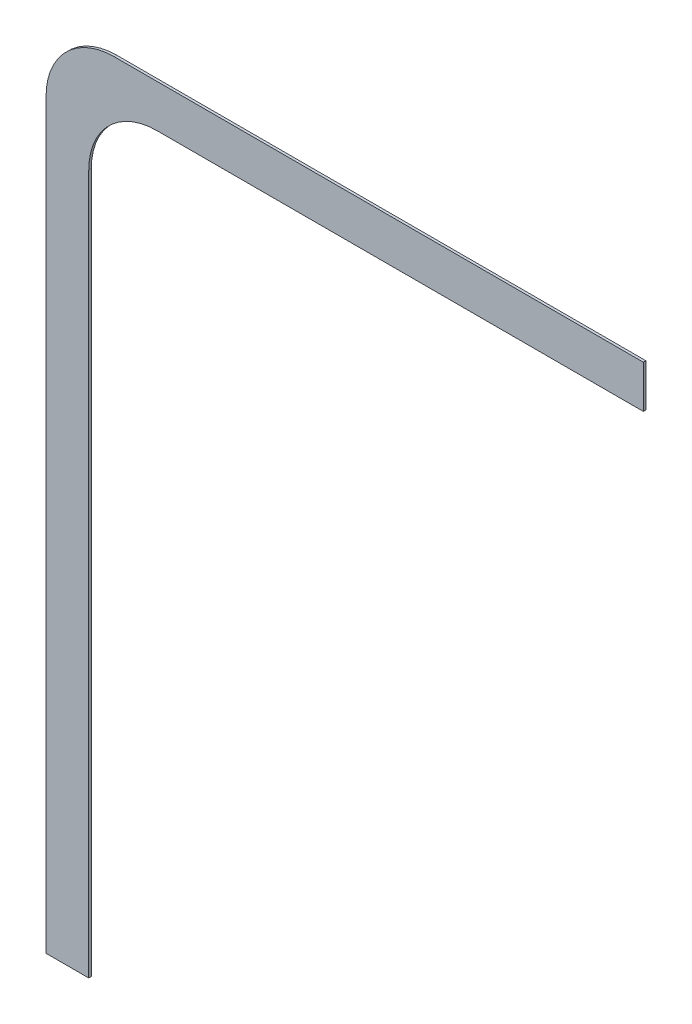
ISO-10303-21;
HEADER;
FILE_DESCRIPTION(('STEP AP214'),'2;1');
FILE_NAME('part.step','',(''),(''),'','','');
FILE_SCHEMA(('AUTOMOTIVE_DESIGN { 1 0 10303 214 1 1 1 1 }'));
ENDSEC;
DATA;
#1=APPLICATION_CONTEXT('core data for automotive mechanical design processes');
#2=APPLICATION_PROTOCOL_DEFINITION('international standard','automotive_design',2000,#1);
#3=PRODUCT_CONTEXT('',#1,'mechanical');
#4=PRODUCT('Part','Part','',(#3));
#5=PRODUCT_RELATED_PRODUCT_CATEGORY('part','',(#4));
#6=PRODUCT_DEFINITION_FORMATION('','',#4);
#7=PRODUCT_DEFINITION_CONTEXT('part definition',#1,'design');
#8=PRODUCT_DEFINITION('design','',#6,#7);
#9=PRODUCT_DEFINITION_SHAPE('','',#8);
#10=(LENGTH_UNIT() NAMED_UNIT(*) SI_UNIT(.MILLI.,.METRE.));
#11=(NAMED_UNIT(*) PLANE_ANGLE_UNIT() SI_UNIT($,.RADIAN.));
#12=(NAMED_UNIT(*) SI_UNIT($,.STERADIAN.) SOLID_ANGLE_UNIT());
#13=UNCERTAINTY_MEASURE_WITH_UNIT(LENGTH_MEASURE(1.E-05),#10,'distance_accuracy_value','');
#14=(GEOMETRIC_REPRESENTATION_CONTEXT(3) GLOBAL_UNCERTAINTY_ASSIGNED_CONTEXT((#13)) GLOBAL_UNIT_ASSIGNED_CONTEXT((#10,
#11,#12)) REPRESENTATION_CONTEXT('',''));
#15=CARTESIAN_POINT('',(0.,0.,0.));
#16=DIRECTION('',(0.,0.,1.));
#17=DIRECTION('',(1.,0.,0.));
#18=AXIS2_PLACEMENT_3D('',#15,#16,#17);
#19=CARTESIAN_POINT('',(50.,0.,3.));
#20=DIRECTION('',(0.,1.,0.));
#21=DIRECTION('',(-1.,0.,0.));
#22=AXIS2_PLACEMENT_3D('',#19,#20,#21);
#23=PLANE('',#22);
#24=DIRECTION('',(1.,0.,0.));
#25=VECTOR('',#24,1.);
#26=CARTESIAN_POINT('',(50.,0.,0.));
#27=LINE('',#26,#25);
#28=CARTESIAN_POINT('',(0.,0.,0.));
#29=VERTEX_POINT('',#28);
#30=CARTESIAN_POINT('',(50.,0.,0.));
#31=VERTEX_POINT('',#30);
#32=EDGE_CURVE('E135',#29,#31,#27,.T.);
#33=ORIENTED_EDGE('',*,*,#32,.T.);
#34=DIRECTION('',(0.,0.,-1.));
#35=VECTOR('',#34,1.);
#36=CARTESIAN_POINT('',(50.,0.,3.));
#37=LINE('',#36,#35);
#38=CARTESIAN_POINT('',(50.,0.,3.));
#39=VERTEX_POINT('',#38);
#40=EDGE_CURVE('E11',#39,#31,#37,.T.);
#41=ORIENTED_EDGE('',*,*,#40,.F.);
#42=DIRECTION('',(1.,0.,0.));
#43=VECTOR('',#42,1.);
#44=CARTESIAN_POINT('',(50.,0.,3.));
#45=LINE('',#44,#43);
#46=CARTESIAN_POINT('',(0.,0.,3.));
#47=VERTEX_POINT('',#46);
#48=EDGE_CURVE('E149',#47,#39,#45,.T.);
#49=ORIENTED_EDGE('',*,*,#48,.F.);
#50=DIRECTION('',(0.,0.,-1.));
#51=VECTOR('',#50,1.);
#52=CARTESIAN_POINT('',(0.,0.,3.));
#53=LINE('',#52,#51);
#54=EDGE_CURVE('E131',#47,#29,#53,.T.);
#55=ORIENTED_EDGE('',*,*,#54,.T.);
#56=EDGE_LOOP('',(#33,#41,#49,#55));
#57=FACE_BOUND('',#56,.T.);
#58=ADVANCED_FACE('F39',(#57),#23,.F.);
#59=CARTESIAN_POINT('',(50.,820.,3.));
#60=DIRECTION('',(-1.,0.,0.));
#61=DIRECTION('',(0.,-1.,0.));
#62=AXIS2_PLACEMENT_3D('',#59,#60,#61);
#63=PLANE('',#62);
#64=DIRECTION('',(0.,1.,0.));
#65=VECTOR('',#64,1.);
#66=CARTESIAN_POINT('',(50.,820.,0.));
#67=LINE('',#66,#65);
#68=CARTESIAN_POINT('',(49.9999999999999,820.,0.));
#69=VERTEX_POINT('',#68);
#70=EDGE_CURVE('E138',#31,#69,#67,.T.);
#71=ORIENTED_EDGE('',*,*,#70,.T.);
#72=DIRECTION('',(0.,0.,-1.));
#73=VECTOR('',#72,1.);
#74=CARTESIAN_POINT('',(49.9999999999999,820.,3.));
#75=LINE('',#74,#73);
#76=CARTESIAN_POINT('',(49.9999999999999,820.,3.));
#77=VERTEX_POINT('',#76);
#78=EDGE_CURVE('E47',#77,#69,#75,.T.);
#79=ORIENTED_EDGE('',*,*,#78,.F.);
#80=DIRECTION('',(0.,1.,0.));
#81=VECTOR('',#80,1.);
#82=CARTESIAN_POINT('',(50.,820.,3.));
#83=LINE('',#82,#81);
#84=EDGE_CURVE('E98',#39,#77,#83,.T.);
#85=ORIENTED_EDGE('',*,*,#84,.F.);
#86=ORIENTED_EDGE('',*,*,#40,.T.);
#87=EDGE_LOOP('',(#71,#79,#85,#86));
#88=FACE_BOUND('',#87,.T.);
#89=ADVANCED_FACE('F184',(#88),#63,.F.);
#90=CARTESIAN_POINT('',(130.,820.,3.));
#91=DIRECTION('',(0.,0.,-1.));
#92=DIRECTION('',(-1.,0.,0.));
#93=AXIS2_PLACEMENT_3D('',#90,#91,#92);
#94=CYLINDRICAL_SURFACE('',#93,80.);
#95=CARTESIAN_POINT('',(130.,820.,0.));
#96=DIRECTION('',(0.,0.,-1.));
#97=DIRECTION('',(1.,0.,0.));
#98=AXIS2_PLACEMENT_3D('',#95,#96,#97);
#99=CIRCLE('',#98,80.);
#100=CARTESIAN_POINT('',(130.,900.,0.));
#101=VERTEX_POINT('',#100);
#102=EDGE_CURVE('E140',#69,#101,#99,.T.);
#103=ORIENTED_EDGE('',*,*,#102,.T.);
#104=DIRECTION('',(0.,0.,-1.));
#105=VECTOR('',#104,1.);
#106=CARTESIAN_POINT('',(130.,900.,3.));
#107=LINE('',#106,#105);
#108=CARTESIAN_POINT('',(130.,900.,3.));
#109=VERTEX_POINT('',#108);
#110=EDGE_CURVE('E156',#109,#101,#107,.T.);
#111=ORIENTED_EDGE('',*,*,#110,.F.);
#112=CARTESIAN_POINT('',(130.,820.,3.));
#113=DIRECTION('',(0.,0.,-1.));
#114=DIRECTION('',(1.,0.,0.));
#115=AXIS2_PLACEMENT_3D('',#112,#113,#114);
#116=CIRCLE('',#115,80.);
#117=EDGE_CURVE('E164',#77,#109,#116,.T.);
#118=ORIENTED_EDGE('',*,*,#117,.F.);
#119=ORIENTED_EDGE('',*,*,#78,.T.);
#120=EDGE_LOOP('',(#103,#111,#118,#119));
#121=FACE_BOUND('',#120,.T.);
#122=ADVANCED_FACE('F162',(#121),#94,.F.);
#123=CARTESIAN_POINT('',(700.,900.,3.));
#124=DIRECTION('',(0.,1.,0.));
#125=DIRECTION('',(-1.,0.,0.));
#126=AXIS2_PLACEMENT_3D('',#123,#124,#125);
#127=PLANE('',#126);
#128=DIRECTION('',(1.,0.,0.));
#129=VECTOR('',#128,1.);
#130=CARTESIAN_POINT('',(700.,900.,0.));
#131=LINE('',#130,#129);
#132=CARTESIAN_POINT('',(700.,900.,0.));
#133=VERTEX_POINT('',#132);
#134=EDGE_CURVE('E142',#101,#133,#131,.T.);
#135=ORIENTED_EDGE('',*,*,#134,.T.);
#136=DIRECTION('',(0.,0.,-1.));
#137=VECTOR('',#136,1.);
#138=CARTESIAN_POINT('',(700.,900.,3.));
#139=LINE('',#138,#137);
#140=CARTESIAN_POINT('',(700.,900.,3.));
#141=VERTEX_POINT('',#140);
#142=EDGE_CURVE('E153',#141,#133,#139,.T.);
#143=ORIENTED_EDGE('',*,*,#142,.F.);
#144=DIRECTION('',(1.,0.,0.));
#145=VECTOR('',#144,1.);
#146=CARTESIAN_POINT('',(700.,900.,3.));
#147=LINE('',#146,#145);
#148=EDGE_CURVE('E176',#109,#141,#147,.T.);
#149=ORIENTED_EDGE('',*,*,#148,.F.);
#150=ORIENTED_EDGE('',*,*,#110,.T.);
#151=EDGE_LOOP('',(#135,#143,#149,#150));
#152=FACE_BOUND('',#151,.T.);
#153=ADVANCED_FACE('F172',(#152),#127,.F.);
#154=CARTESIAN_POINT('',(700.,950.,3.));
#155=DIRECTION('',(-1.,0.,0.));
#156=DIRECTION('',(0.,0.,1.));
#157=AXIS2_PLACEMENT_3D('',#154,#155,#156);
#158=PLANE('',#157);
#159=DIRECTION('',(0.,1.,0.));
#160=VECTOR('',#159,1.);
#161=CARTESIAN_POINT('',(700.,950.,0.));
#162=LINE('',#161,#160);
#163=CARTESIAN_POINT('',(700.,950.,0.));
#164=VERTEX_POINT('',#163);
#165=EDGE_CURVE('E144',#133,#164,#162,.T.);
#166=ORIENTED_EDGE('',*,*,#165,.T.);
#167=DIRECTION('',(0.,0.,-1.));
#168=VECTOR('',#167,1.);
#169=CARTESIAN_POINT('',(700.,950.,3.));
#170=LINE('',#169,#168);
#171=CARTESIAN_POINT('',(700.,950.,3.));
#172=VERTEX_POINT('',#171);
#173=EDGE_CURVE('E126',#172,#164,#170,.T.);
#174=ORIENTED_EDGE('',*,*,#173,.F.);
#175=DIRECTION('',(0.,1.,0.));
#176=VECTOR('',#175,1.);
#177=CARTESIAN_POINT('',(700.,950.,3.));
#178=LINE('',#177,#176);
#179=EDGE_CURVE('E117',#141,#172,#178,.T.);
#180=ORIENTED_EDGE('',*,*,#179,.F.);
#181=ORIENTED_EDGE('',*,*,#142,.T.);
#182=EDGE_LOOP('',(#166,#174,#180,#181));
#183=FACE_BOUND('',#182,.T.);
#184=ADVANCED_FACE('F175',(#183),#158,.F.);
#185=CARTESIAN_POINT('',(80.,950.,3.));
#186=DIRECTION('',(0.,-1.,0.));
#187=DIRECTION('',(1.,0.,0.));
#188=AXIS2_PLACEMENT_3D('',#185,#186,#187);
#189=PLANE('',#188);
#190=DIRECTION('',(-1.,0.,0.));
#191=VECTOR('',#190,1.);
#192=CARTESIAN_POINT('',(80.,950.,0.));
#193=LINE('',#192,#191);
#194=CARTESIAN_POINT('',(80.,950.,0.));
#195=VERTEX_POINT('',#194);
#196=EDGE_CURVE('E125',#164,#195,#193,.T.);
#197=ORIENTED_EDGE('',*,*,#196,.T.);
#198=DIRECTION('',(0.,0.,-1.));
#199=VECTOR('',#198,1.);
#200=CARTESIAN_POINT('',(80.,950.,3.));
#201=LINE('',#200,#199);
#202=CARTESIAN_POINT('',(80.,950.,3.));
#203=VERTEX_POINT('',#202);
#204=EDGE_CURVE('E122',#203,#195,#201,.T.);
#205=ORIENTED_EDGE('',*,*,#204,.F.);
#206=DIRECTION('',(-1.,0.,0.));
#207=VECTOR('',#206,1.);
#208=CARTESIAN_POINT('',(80.,950.,3.));
#209=LINE('',#208,#207);
#210=EDGE_CURVE('E111',#172,#203,#209,.T.);
#211=ORIENTED_EDGE('',*,*,#210,.F.);
#212=ORIENTED_EDGE('',*,*,#173,.T.);
#213=EDGE_LOOP('',(#197,#205,#211,#212));
#214=FACE_BOUND('',#213,.T.);
#215=ADVANCED_FACE('F123',(#214),#189,.F.);
#216=CARTESIAN_POINT('',(80.,870.,3.));
#217=DIRECTION('',(0.,0.,-1.));
#218=DIRECTION('',(-1.,0.,0.));
#219=AXIS2_PLACEMENT_3D('',#216,#217,#218);
#220=CYLINDRICAL_SURFACE('',#219,80.);
#221=CARTESIAN_POINT('',(80.,870.,0.));
#222=DIRECTION('',(0.,0.,1.));
#223=DIRECTION('',(-1.,0.,0.));
#224=AXIS2_PLACEMENT_3D('',#221,#222,#223);
#225=CIRCLE('',#224,80.);
#226=CARTESIAN_POINT('',(0.,870.,0.));
#227=VERTEX_POINT('',#226);
#228=EDGE_CURVE('E84',#195,#227,#225,.T.);
#229=ORIENTED_EDGE('',*,*,#228,.T.);
#230=DIRECTION('',(0.,0.,-1.));
#231=VECTOR('',#230,1.);
#232=CARTESIAN_POINT('',(0.,870.,3.));
#233=LINE('',#232,#231);
#234=CARTESIAN_POINT('',(0.,870.,3.));
#235=VERTEX_POINT('',#234);
#236=EDGE_CURVE('E127',#235,#227,#233,.T.);
#237=ORIENTED_EDGE('',*,*,#236,.F.);
#238=CARTESIAN_POINT('',(80.,870.,3.));
#239=DIRECTION('',(0.,0.,1.));
#240=DIRECTION('',(-1.,0.,0.));
#241=AXIS2_PLACEMENT_3D('',#238,#239,#240);
#242=CIRCLE('',#241,80.);
#243=EDGE_CURVE('E115',#203,#235,#242,.T.);
#244=ORIENTED_EDGE('',*,*,#243,.F.);
#245=ORIENTED_EDGE('',*,*,#204,.T.);
#246=EDGE_LOOP('',(#229,#237,#244,#245));
#247=FACE_BOUND('',#246,.T.);
#248=ADVANCED_FACE('F129',(#247),#220,.T.);
#249=CARTESIAN_POINT('',(0.,0.,3.));
#250=DIRECTION('',(1.,0.,0.));
#251=DIRECTION('',(0.,0.,-1.));
#252=AXIS2_PLACEMENT_3D('',#249,#250,#251);
#253=PLANE('',#252);
#254=DIRECTION('',(0.,-1.,0.));
#255=VECTOR('',#254,1.);
#256=CARTESIAN_POINT('',(0.,0.,0.));
#257=LINE('',#256,#255);
#258=EDGE_CURVE('E90',#227,#29,#257,.T.);
#259=ORIENTED_EDGE('',*,*,#258,.T.);
#260=ORIENTED_EDGE('',*,*,#54,.F.);
#261=DIRECTION('',(0.,-1.,0.));
#262=VECTOR('',#261,1.);
#263=CARTESIAN_POINT('',(0.,0.,3.));
#264=LINE('',#263,#262);
#265=EDGE_CURVE('E55',#235,#47,#264,.T.);
#266=ORIENTED_EDGE('',*,*,#265,.F.);
#267=ORIENTED_EDGE('',*,*,#236,.T.);
#268=EDGE_LOOP('',(#259,#260,#266,#267));
#269=FACE_BOUND('',#268,.T.);
#270=ADVANCED_FACE('F200',(#269),#253,.F.);
#271=CARTESIAN_POINT('',(80.,870.,3.));
#272=DIRECTION('',(0.,0.,-1.));
#273=DIRECTION('',(-1.,0.,0.));
#274=AXIS2_PLACEMENT_3D('',#271,#272,#273);
#275=PLANE('',#274);
#276=ORIENTED_EDGE('',*,*,#48,.T.);
#277=ORIENTED_EDGE('',*,*,#84,.T.);
#278=ORIENTED_EDGE('',*,*,#117,.T.);
#279=ORIENTED_EDGE('',*,*,#148,.T.);
#280=ORIENTED_EDGE('',*,*,#179,.T.);
#281=ORIENTED_EDGE('',*,*,#210,.T.);
#282=ORIENTED_EDGE('',*,*,#243,.T.);
#283=ORIENTED_EDGE('',*,*,#265,.T.);
#284=EDGE_LOOP('',(#276,#277,#278,#279,#280,#281,#282,#283));
#285=FACE_BOUND('',#284,.T.);
#286=ADVANCED_FACE('F113',(#285),#275,.F.);
#287=CARTESIAN_POINT('',(80.,870.,0.));
#288=DIRECTION('',(0.,0.,-1.));
#289=DIRECTION('',(-1.,0.,0.));
#290=AXIS2_PLACEMENT_3D('',#287,#288,#289);
#291=PLANE('',#290);
#292=ORIENTED_EDGE('',*,*,#32,.F.);
#293=ORIENTED_EDGE('',*,*,#258,.F.);
#294=ORIENTED_EDGE('',*,*,#228,.F.);
#295=ORIENTED_EDGE('',*,*,#196,.F.);
#296=ORIENTED_EDGE('',*,*,#165,.F.);
#297=ORIENTED_EDGE('',*,*,#134,.F.);
#298=ORIENTED_EDGE('',*,*,#102,.F.);
#299=ORIENTED_EDGE('',*,*,#70,.F.);
#300=EDGE_LOOP('',(#292,#293,#294,#295,#296,#297,#298,#299));
#301=FACE_BOUND('',#300,.T.);
#302=ADVANCED_FACE('F168',(#301),#291,.T.);
#303=CLOSED_SHELL('',(#58,#89,#122,#153,#184,#215,#248,#270,#286,#302));
#304=MANIFOLD_SOLID_BREP('B2',#303);
#305=ADVANCED_BREP_SHAPE_REPRESENTATION('',(#18,#304),#14);
#306=SHAPE_DEFINITION_REPRESENTATION(#9,#305);
ENDSEC;
END-ISO-10303-21;
